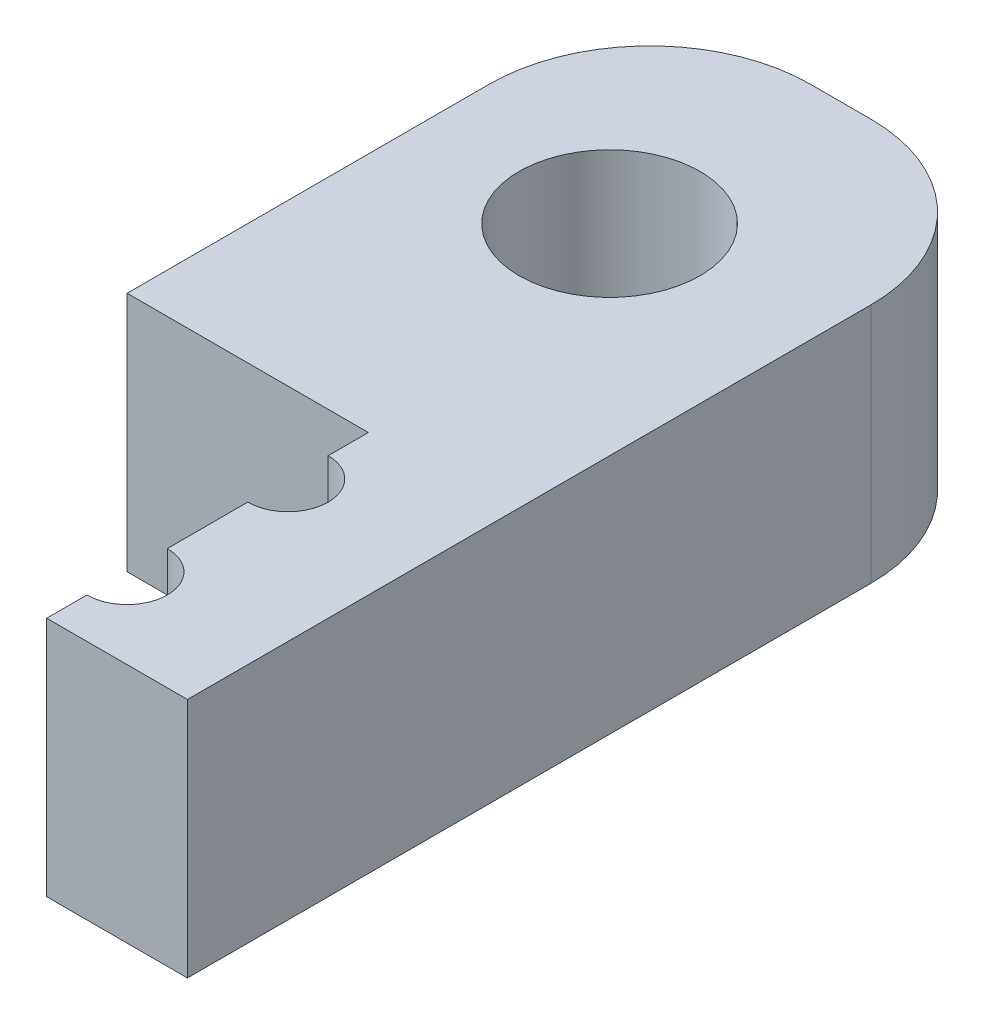
ISO-10303-21;
HEADER;
FILE_DESCRIPTION(('STEP AP214'),'2;1');
FILE_NAME('part.step','',(''),(''),'','','');
FILE_SCHEMA(('AUTOMOTIVE_DESIGN { 1 0 10303 214 1 1 1 1 }'));
ENDSEC;
DATA;
#1=APPLICATION_CONTEXT('core data for automotive mechanical design processes');
#2=APPLICATION_PROTOCOL_DEFINITION('international standard','automotive_design',2000,#1);
#3=PRODUCT_CONTEXT('',#1,'mechanical');
#4=PRODUCT('Part','Part','',(#3));
#5=PRODUCT_RELATED_PRODUCT_CATEGORY('part','',(#4));
#6=PRODUCT_DEFINITION_FORMATION('','',#4);
#7=PRODUCT_DEFINITION_CONTEXT('part definition',#1,'design');
#8=PRODUCT_DEFINITION('design','',#6,#7);
#9=PRODUCT_DEFINITION_SHAPE('','',#8);
#10=(LENGTH_UNIT() NAMED_UNIT(*) SI_UNIT(.MILLI.,.METRE.));
#11=(NAMED_UNIT(*) PLANE_ANGLE_UNIT() SI_UNIT($,.RADIAN.));
#12=(NAMED_UNIT(*) SI_UNIT($,.STERADIAN.) SOLID_ANGLE_UNIT());
#13=UNCERTAINTY_MEASURE_WITH_UNIT(LENGTH_MEASURE(1.E-05),#10,'distance_accuracy_value','');
#14=(GEOMETRIC_REPRESENTATION_CONTEXT(3) GLOBAL_UNCERTAINTY_ASSIGNED_CONTEXT((#13)) GLOBAL_UNIT_ASSIGNED_CONTEXT((#10,
#11,#12)) REPRESENTATION_CONTEXT('',''));
#15=CARTESIAN_POINT('',(0.,0.,0.));
#16=DIRECTION('',(0.,0.,1.));
#17=DIRECTION('',(1.,0.,0.));
#18=AXIS2_PLACEMENT_3D('',#15,#16,#17);
#19=CARTESIAN_POINT('',(6.,6.,0.));
#20=DIRECTION('',(1.,0.,0.));
#21=DIRECTION('',(0.,0.,-1.));
#22=AXIS2_PLACEMENT_3D('',#19,#20,#21);
#23=PLANE('',#22);
#24=DIRECTION('',(0.,0.,1.));
#25=VECTOR('',#24,1.);
#26=CARTESIAN_POINT('',(6.,0.,0.));
#27=LINE('',#26,#25);
#28=CARTESIAN_POINT('',(6.,0.,3.));
#29=VERTEX_POINT('',#28);
#30=CARTESIAN_POINT('',(6.,0.,5.));
#31=VERTEX_POINT('',#30);
#32=EDGE_CURVE('E151',#29,#31,#27,.T.);
#33=ORIENTED_EDGE('',*,*,#32,.T.);
#34=DIRECTION('',(0.,1.,0.));
#35=VECTOR('',#34,1.);
#36=CARTESIAN_POINT('',(6.,0.,5.));
#37=LINE('',#36,#35);
#38=CARTESIAN_POINT('',(6.,6.,5.));
#39=VERTEX_POINT('',#38);
#40=EDGE_CURVE('E131',#31,#39,#37,.T.);
#41=ORIENTED_EDGE('',*,*,#40,.T.);
#42=DIRECTION('',(0.,0.,1.));
#43=VECTOR('',#42,1.);
#44=CARTESIAN_POINT('',(6.,6.,0.));
#45=LINE('',#44,#43);
#46=CARTESIAN_POINT('',(6.,6.,3.));
#47=VERTEX_POINT('',#46);
#48=EDGE_CURVE('E221',#47,#39,#45,.T.);
#49=ORIENTED_EDGE('',*,*,#48,.F.);
#50=DIRECTION('',(0.,1.,0.));
#51=VECTOR('',#50,1.);
#52=CARTESIAN_POINT('',(6.,0.,3.));
#53=LINE('',#52,#51);
#54=EDGE_CURVE('E225',#47,#29,#53,.F.);
#55=ORIENTED_EDGE('',*,*,#54,.T.);
#56=EDGE_LOOP('',(#33,#41,#49,#55));
#57=FACE_BOUND('',#56,.T.);
#58=ADVANCED_FACE('F35',(#57),#23,.F.);
#59=CARTESIAN_POINT('',(6.,0.,0.));
#60=VERTEX_POINT('',#59);
#61=CARTESIAN_POINT('',(6.,0.,1.));
#62=VERTEX_POINT('',#61);
#63=EDGE_CURVE('E154',#60,#62,#27,.T.);
#64=ORIENTED_EDGE('',*,*,#63,.T.);
#65=DIRECTION('',(0.,1.,0.));
#66=VECTOR('',#65,1.);
#67=CARTESIAN_POINT('',(6.,0.,1.));
#68=LINE('',#67,#66);
#69=CARTESIAN_POINT('',(6.,6.,1.));
#70=VERTEX_POINT('',#69);
#71=EDGE_CURVE('E214',#62,#70,#68,.T.);
#72=ORIENTED_EDGE('',*,*,#71,.T.);
#73=CARTESIAN_POINT('',(6.,6.,0.));
#74=VERTEX_POINT('',#73);
#75=EDGE_CURVE('E218',#74,#70,#45,.T.);
#76=ORIENTED_EDGE('',*,*,#75,.F.);
#77=DIRECTION('',(0.,-1.,0.));
#78=VECTOR('',#77,1.);
#79=CARTESIAN_POINT('',(6.,6.,0.));
#80=LINE('',#79,#78);
#81=EDGE_CURVE('E175',#74,#60,#80,.T.);
#82=ORIENTED_EDGE('',*,*,#81,.T.);
#83=EDGE_LOOP('',(#64,#72,#76,#82));
#84=FACE_BOUND('',#83,.T.);
#85=ADVANCED_FACE('F261',(#84),#23,.F.);
#86=CARTESIAN_POINT('',(9.5,6.,8.));
#87=DIRECTION('',(-1.,0.,0.));
#88=DIRECTION('',(0.,0.,1.));
#89=AXIS2_PLACEMENT_3D('',#86,#87,#88);
#90=PLANE('',#89);
#91=DIRECTION('',(0.,0.,-1.));
#92=VECTOR('',#91,1.);
#93=CARTESIAN_POINT('',(9.5,0.,8.));
#94=LINE('',#93,#92);
#95=CARTESIAN_POINT('',(9.5,0.,8.));
#96=VERTEX_POINT('',#95);
#97=CARTESIAN_POINT('',(9.5,0.,-9.));
#98=VERTEX_POINT('',#97);
#99=EDGE_CURVE('E211',#96,#98,#94,.T.);
#100=ORIENTED_EDGE('',*,*,#99,.T.);
#101=DIRECTION('',(0.,-1.,0.));
#102=VECTOR('',#101,1.);
#103=CARTESIAN_POINT('',(9.5,6.,-9.));
#104=LINE('',#103,#102);
#105=CARTESIAN_POINT('',(9.5,6.,-9.));
#106=VERTEX_POINT('',#105);
#107=EDGE_CURVE('E11',#98,#106,#104,.F.);
#108=ORIENTED_EDGE('',*,*,#107,.T.);
#109=DIRECTION('',(0.,0.,-1.));
#110=VECTOR('',#109,1.);
#111=CARTESIAN_POINT('',(9.5,6.,8.));
#112=LINE('',#111,#110);
#113=CARTESIAN_POINT('',(9.5,6.,8.));
#114=VERTEX_POINT('',#113);
#115=EDGE_CURVE('E163',#114,#106,#112,.T.);
#116=ORIENTED_EDGE('',*,*,#115,.F.);
#117=DIRECTION('',(0.,-1.,0.));
#118=VECTOR('',#117,1.);
#119=CARTESIAN_POINT('',(9.5,6.,8.));
#120=LINE('',#119,#118);
#121=EDGE_CURVE('E170',#114,#96,#120,.T.);
#122=ORIENTED_EDGE('',*,*,#121,.T.);
#123=EDGE_LOOP('',(#100,#108,#116,#122));
#124=FACE_BOUND('',#123,.T.);
#125=ADVANCED_FACE('F267',(#124),#90,.F.);
#126=CARTESIAN_POINT('',(0.,6.,-13.));
#127=DIRECTION('',(0.,0.,1.));
#128=DIRECTION('',(1.,0.,0.));
#129=AXIS2_PLACEMENT_3D('',#126,#127,#128);
#130=PLANE('',#129);
#131=DIRECTION('',(-1.,0.,0.));
#132=VECTOR('',#131,1.);
#133=CARTESIAN_POINT('',(0.,0.,-13.));
#134=LINE('',#133,#132);
#135=CARTESIAN_POINT('',(5.5,0.,-13.));
#136=VERTEX_POINT('',#135);
#137=CARTESIAN_POINT('',(4.,0.,-13.));
#138=VERTEX_POINT('',#137);
#139=EDGE_CURVE('E207',#136,#138,#134,.T.);
#140=ORIENTED_EDGE('',*,*,#139,.T.);
#141=DIRECTION('',(0.,-1.,0.));
#142=VECTOR('',#141,1.);
#143=CARTESIAN_POINT('',(4.,6.,-13.));
#144=LINE('',#143,#142);
#145=CARTESIAN_POINT('',(4.,6.,-13.));
#146=VERTEX_POINT('',#145);
#147=EDGE_CURVE('E56',#138,#146,#144,.F.);
#148=ORIENTED_EDGE('',*,*,#147,.T.);
#149=DIRECTION('',(-1.,0.,0.));
#150=VECTOR('',#149,1.);
#151=CARTESIAN_POINT('',(0.,6.,-13.));
#152=LINE('',#151,#150);
#153=CARTESIAN_POINT('',(5.5,6.,-13.));
#154=VERTEX_POINT('',#153);
#155=EDGE_CURVE('E167',#154,#146,#152,.T.);
#156=ORIENTED_EDGE('',*,*,#155,.F.);
#157=DIRECTION('',(0.,-1.,0.));
#158=VECTOR('',#157,1.);
#159=CARTESIAN_POINT('',(5.5,6.,-13.));
#160=LINE('',#159,#158);
#161=EDGE_CURVE('E187',#154,#136,#160,.T.);
#162=ORIENTED_EDGE('',*,*,#161,.T.);
#163=EDGE_LOOP('',(#140,#148,#156,#162));
#164=FACE_BOUND('',#163,.T.);
#165=ADVANCED_FACE('F209',(#164),#130,.F.);
#166=CARTESIAN_POINT('',(0.,6.,0.));
#167=DIRECTION('',(1.,0.,0.));
#168=DIRECTION('',(0.,0.,-1.));
#169=AXIS2_PLACEMENT_3D('',#166,#167,#168);
#170=PLANE('',#169);
#171=DIRECTION('',(0.,0.,1.));
#172=VECTOR('',#171,1.);
#173=CARTESIAN_POINT('',(0.,6.,0.));
#174=LINE('',#173,#172);
#175=CARTESIAN_POINT('',(0.,6.,-9.));
#176=VERTEX_POINT('',#175);
#177=CARTESIAN_POINT('',(0.,6.,0.));
#178=VERTEX_POINT('',#177);
#179=EDGE_CURVE('E196',#176,#178,#174,.T.);
#180=ORIENTED_EDGE('',*,*,#179,.F.);
#181=DIRECTION('',(0.,-1.,0.));
#182=VECTOR('',#181,1.);
#183=CARTESIAN_POINT('',(0.,6.,-9.));
#184=LINE('',#183,#182);
#185=CARTESIAN_POINT('',(0.,0.,-9.));
#186=VERTEX_POINT('',#185);
#187=EDGE_CURVE('E180',#176,#186,#184,.T.);
#188=ORIENTED_EDGE('',*,*,#187,.T.);
#189=DIRECTION('',(0.,0.,1.));
#190=VECTOR('',#189,1.);
#191=CARTESIAN_POINT('',(0.,0.,0.));
#192=LINE('',#191,#190);
#193=CARTESIAN_POINT('',(0.,0.,0.));
#194=VERTEX_POINT('',#193);
#195=EDGE_CURVE('E155',#186,#194,#192,.T.);
#196=ORIENTED_EDGE('',*,*,#195,.T.);
#197=DIRECTION('',(0.,-1.,0.));
#198=VECTOR('',#197,1.);
#199=CARTESIAN_POINT('',(0.,6.,0.));
#200=LINE('',#199,#198);
#201=EDGE_CURVE('E177',#178,#194,#200,.T.);
#202=ORIENTED_EDGE('',*,*,#201,.F.);
#203=EDGE_LOOP('',(#180,#188,#196,#202));
#204=FACE_BOUND('',#203,.T.);
#205=ADVANCED_FACE('F201',(#204),#170,.F.);
#206=CARTESIAN_POINT('',(0.,6.,0.));
#207=DIRECTION('',(0.,0.,-1.));
#208=DIRECTION('',(-1.,0.,0.));
#209=AXIS2_PLACEMENT_3D('',#206,#207,#208);
#210=PLANE('',#209);
#211=DIRECTION('',(1.,0.,0.));
#212=VECTOR('',#211,1.);
#213=CARTESIAN_POINT('',(0.,0.,0.));
#214=LINE('',#213,#212);
#215=EDGE_CURVE('E152',#194,#60,#214,.T.);
#216=ORIENTED_EDGE('',*,*,#215,.T.);
#217=ORIENTED_EDGE('',*,*,#81,.F.);
#218=DIRECTION('',(1.,0.,0.));
#219=VECTOR('',#218,1.);
#220=CARTESIAN_POINT('',(0.,6.,0.));
#221=LINE('',#220,#219);
#222=EDGE_CURVE('E203',#178,#74,#221,.T.);
#223=ORIENTED_EDGE('',*,*,#222,.F.);
#224=ORIENTED_EDGE('',*,*,#201,.T.);
#225=EDGE_LOOP('',(#216,#217,#223,#224));
#226=FACE_BOUND('',#225,.T.);
#227=ADVANCED_FACE('F270',(#226),#210,.F.);
#228=CARTESIAN_POINT('',(6.,6.,7.));
#229=VERTEX_POINT('',#228);
#230=CARTESIAN_POINT('',(6.,6.,8.));
#231=VERTEX_POINT('',#230);
#232=EDGE_CURVE('E144',#229,#231,#45,.T.);
#233=ORIENTED_EDGE('',*,*,#232,.F.);
#234=DIRECTION('',(0.,1.,0.));
#235=VECTOR('',#234,1.);
#236=CARTESIAN_POINT('',(6.,0.,7.));
#237=LINE('',#236,#235);
#238=CARTESIAN_POINT('',(6.,0.,7.));
#239=VERTEX_POINT('',#238);
#240=EDGE_CURVE('E128',#229,#239,#237,.F.);
#241=ORIENTED_EDGE('',*,*,#240,.T.);
#242=CARTESIAN_POINT('',(6.,0.,8.));
#243=VERTEX_POINT('',#242);
#244=EDGE_CURVE('E142',#239,#243,#27,.T.);
#245=ORIENTED_EDGE('',*,*,#244,.T.);
#246=DIRECTION('',(0.,-1.,0.));
#247=VECTOR('',#246,1.);
#248=CARTESIAN_POINT('',(6.,6.,8.));
#249=LINE('',#248,#247);
#250=EDGE_CURVE('E172',#231,#243,#249,.T.);
#251=ORIENTED_EDGE('',*,*,#250,.F.);
#252=EDGE_LOOP('',(#233,#241,#245,#251));
#253=FACE_BOUND('',#252,.T.);
#254=ADVANCED_FACE('F140',(#253),#23,.F.);
#255=CARTESIAN_POINT('',(6.,6.,8.));
#256=DIRECTION('',(0.,0.,-1.));
#257=DIRECTION('',(-1.,0.,0.));
#258=AXIS2_PLACEMENT_3D('',#255,#256,#257);
#259=PLANE('',#258);
#260=DIRECTION('',(1.,0.,0.));
#261=VECTOR('',#260,1.);
#262=CARTESIAN_POINT('',(6.,0.,8.));
#263=LINE('',#262,#261);
#264=EDGE_CURVE('E150',#243,#96,#263,.T.);
#265=ORIENTED_EDGE('',*,*,#264,.T.);
#266=ORIENTED_EDGE('',*,*,#121,.F.);
#267=DIRECTION('',(1.,0.,0.));
#268=VECTOR('',#267,1.);
#269=CARTESIAN_POINT('',(6.,6.,8.));
#270=LINE('',#269,#268);
#271=EDGE_CURVE('E173',#231,#114,#270,.T.);
#272=ORIENTED_EDGE('',*,*,#271,.F.);
#273=ORIENTED_EDGE('',*,*,#250,.T.);
#274=EDGE_LOOP('',(#265,#266,#272,#273));
#275=FACE_BOUND('',#274,.T.);
#276=ADVANCED_FACE('F250',(#275),#259,.F.);
#277=CARTESIAN_POINT('',(0.,6.,0.));
#278=DIRECTION('',(0.,-1.,0.));
#279=DIRECTION('',(0.,0.,-1.));
#280=AXIS2_PLACEMENT_3D('',#277,#278,#279);
#281=PLANE('',#280);
#282=CARTESIAN_POINT('',(4.5,6.,-7.5));
#283=DIRECTION('',(0.,1.,0.));
#284=DIRECTION('',(0.,0.,1.));
#285=AXIS2_PLACEMENT_3D('',#282,#283,#284);
#286=CIRCLE('',#285,2.25);
#287=CARTESIAN_POINT('',(4.5,6.,-5.25));
#288=VERTEX_POINT('',#287);
#289=EDGE_CURVE('E236',#288,#288,#286,.T.);
#290=ORIENTED_EDGE('',*,*,#289,.F.);
#291=EDGE_LOOP('',(#290));
#292=FACE_BOUND('',#291,.T.);
#293=ORIENTED_EDGE('',*,*,#155,.T.);
#294=CARTESIAN_POINT('',(4.,6.,-9.));
#295=DIRECTION('',(0.,-1.,0.));
#296=DIRECTION('',(0.,0.,-1.));
#297=AXIS2_PLACEMENT_3D('',#294,#295,#296);
#298=CIRCLE('',#297,4.);
#299=EDGE_CURVE('E43',#146,#176,#298,.F.);
#300=ORIENTED_EDGE('',*,*,#299,.T.);
#301=ORIENTED_EDGE('',*,*,#179,.T.);
#302=ORIENTED_EDGE('',*,*,#222,.T.);
#303=ORIENTED_EDGE('',*,*,#75,.T.);
#304=CARTESIAN_POINT('',(6.,6.,2.));
#305=DIRECTION('',(0.,1.,0.));
#306=DIRECTION('',(0.,0.,1.));
#307=AXIS2_PLACEMENT_3D('',#304,#305,#306);
#308=CIRCLE('',#307,1.);
#309=EDGE_CURVE('E229',#47,#70,#308,.T.);
#310=ORIENTED_EDGE('',*,*,#309,.F.);
#311=ORIENTED_EDGE('',*,*,#48,.T.);
#312=CARTESIAN_POINT('',(6.,6.,6.));
#313=DIRECTION('',(0.,1.,0.));
#314=DIRECTION('',(0.,0.,1.));
#315=AXIS2_PLACEMENT_3D('',#312,#313,#314);
#316=CIRCLE('',#315,1.);
#317=EDGE_CURVE('E136',#229,#39,#316,.T.);
#318=ORIENTED_EDGE('',*,*,#317,.F.);
#319=ORIENTED_EDGE('',*,*,#232,.T.);
#320=ORIENTED_EDGE('',*,*,#271,.T.);
#321=ORIENTED_EDGE('',*,*,#115,.T.);
#322=CARTESIAN_POINT('',(5.5,6.,-9.));
#323=DIRECTION('',(0.,-1.,0.));
#324=DIRECTION('',(0.,0.,-1.));
#325=AXIS2_PLACEMENT_3D('',#322,#323,#324);
#326=CIRCLE('',#325,4.);
#327=EDGE_CURVE('E191',#106,#154,#326,.F.);
#328=ORIENTED_EDGE('',*,*,#327,.T.);
#329=EDGE_LOOP('',(#293,#300,#301,#302,#303,#310,#311,#318,#319,#320,#321,#328));
#330=FACE_BOUND('',#329,.T.);
#331=ADVANCED_FACE('F195',(#292,#330),#281,.F.);
#332=CARTESIAN_POINT('',(0.,0.,0.));
#333=DIRECTION('',(0.,-1.,0.));
#334=DIRECTION('',(0.,0.,-1.));
#335=AXIS2_PLACEMENT_3D('',#332,#333,#334);
#336=PLANE('',#335);
#337=CARTESIAN_POINT('',(4.5,0.,-7.5));
#338=DIRECTION('',(0.,1.,0.));
#339=DIRECTION('',(0.,0.,1.));
#340=AXIS2_PLACEMENT_3D('',#337,#338,#339);
#341=CIRCLE('',#340,2.25);
#342=CARTESIAN_POINT('',(4.5,0.,-5.25));
#343=VERTEX_POINT('',#342);
#344=EDGE_CURVE('E234',#343,#343,#341,.T.);
#345=ORIENTED_EDGE('',*,*,#344,.T.);
#346=EDGE_LOOP('',(#345));
#347=FACE_BOUND('',#346,.T.);
#348=ORIENTED_EDGE('',*,*,#195,.F.);
#349=CARTESIAN_POINT('',(4.,0.,-9.));
#350=DIRECTION('',(0.,-1.,0.));
#351=DIRECTION('',(0.,0.,-1.));
#352=AXIS2_PLACEMENT_3D('',#349,#350,#351);
#353=CIRCLE('',#352,4.);
#354=EDGE_CURVE('E185',#186,#138,#353,.T.);
#355=ORIENTED_EDGE('',*,*,#354,.T.);
#356=ORIENTED_EDGE('',*,*,#139,.F.);
#357=CARTESIAN_POINT('',(5.5,0.,-9.));
#358=DIRECTION('',(0.,-1.,0.));
#359=DIRECTION('',(0.,0.,-1.));
#360=AXIS2_PLACEMENT_3D('',#357,#358,#359);
#361=CIRCLE('',#360,4.);
#362=EDGE_CURVE('E183',#136,#98,#361,.T.);
#363=ORIENTED_EDGE('',*,*,#362,.T.);
#364=ORIENTED_EDGE('',*,*,#99,.F.);
#365=ORIENTED_EDGE('',*,*,#264,.F.);
#366=ORIENTED_EDGE('',*,*,#244,.F.);
#367=CARTESIAN_POINT('',(6.,0.,6.));
#368=DIRECTION('',(0.,1.,0.));
#369=DIRECTION('',(0.,0.,1.));
#370=AXIS2_PLACEMENT_3D('',#367,#368,#369);
#371=CIRCLE('',#370,1.);
#372=EDGE_CURVE('E125',#239,#31,#371,.T.);
#373=ORIENTED_EDGE('',*,*,#372,.T.);
#374=ORIENTED_EDGE('',*,*,#32,.F.);
#375=CARTESIAN_POINT('',(6.,0.,2.));
#376=DIRECTION('',(0.,1.,0.));
#377=DIRECTION('',(0.,0.,1.));
#378=AXIS2_PLACEMENT_3D('',#375,#376,#377);
#379=CIRCLE('',#378,1.);
#380=EDGE_CURVE('E228',#29,#62,#379,.T.);
#381=ORIENTED_EDGE('',*,*,#380,.T.);
#382=ORIENTED_EDGE('',*,*,#63,.F.);
#383=ORIENTED_EDGE('',*,*,#215,.F.);
#384=EDGE_LOOP('',(#348,#355,#356,#363,#364,#365,#366,#373,#374,#381,#382,#383));
#385=FACE_BOUND('',#384,.T.);
#386=ADVANCED_FACE('F148',(#347,#385),#336,.T.);
#387=CARTESIAN_POINT('',(6.,0.,2.));
#388=DIRECTION('',(0.,1.,0.));
#389=DIRECTION('',(0.,0.,1.));
#390=AXIS2_PLACEMENT_3D('',#387,#388,#389);
#391=CYLINDRICAL_SURFACE('',#390,1.);
#392=ORIENTED_EDGE('',*,*,#380,.F.);
#393=ORIENTED_EDGE('',*,*,#54,.F.);
#394=ORIENTED_EDGE('',*,*,#309,.T.);
#395=ORIENTED_EDGE('',*,*,#71,.F.);
#396=EDGE_LOOP('',(#392,#393,#394,#395));
#397=FACE_BOUND('',#396,.T.);
#398=ADVANCED_FACE('F256',(#397),#391,.F.);
#399=CARTESIAN_POINT('',(6.,0.,6.));
#400=DIRECTION('',(0.,1.,0.));
#401=DIRECTION('',(0.,0.,1.));
#402=AXIS2_PLACEMENT_3D('',#399,#400,#401);
#403=CYLINDRICAL_SURFACE('',#402,1.);
#404=ORIENTED_EDGE('',*,*,#372,.F.);
#405=ORIENTED_EDGE('',*,*,#240,.F.);
#406=ORIENTED_EDGE('',*,*,#317,.T.);
#407=ORIENTED_EDGE('',*,*,#40,.F.);
#408=EDGE_LOOP('',(#404,#405,#406,#407));
#409=FACE_BOUND('',#408,.T.);
#410=ADVANCED_FACE('F127',(#409),#403,.F.);
#411=CARTESIAN_POINT('',(4.5,0.,-7.5));
#412=DIRECTION('',(0.,1.,0.));
#413=DIRECTION('',(0.,0.,1.));
#414=AXIS2_PLACEMENT_3D('',#411,#412,#413);
#415=CYLINDRICAL_SURFACE('',#414,2.25);
#416=ORIENTED_EDGE('',*,*,#344,.F.);
#417=EDGE_LOOP('',(#416));
#418=FACE_BOUND('',#417,.T.);
#419=ORIENTED_EDGE('',*,*,#289,.T.);
#420=EDGE_LOOP('',(#419));
#421=FACE_BOUND('',#420,.T.);
#422=ADVANCED_FACE('F243',(#418,#421),#415,.F.);
#423=CARTESIAN_POINT('',(4.,6.,-9.));
#424=DIRECTION('',(0.,-1.,0.));
#425=DIRECTION('',(0.,0.,-1.));
#426=AXIS2_PLACEMENT_3D('',#423,#424,#425);
#427=CYLINDRICAL_SURFACE('',#426,4.);
#428=ORIENTED_EDGE('',*,*,#299,.F.);
#429=ORIENTED_EDGE('',*,*,#147,.F.);
#430=ORIENTED_EDGE('',*,*,#354,.F.);
#431=ORIENTED_EDGE('',*,*,#187,.F.);
#432=EDGE_LOOP('',(#428,#429,#430,#431));
#433=FACE_BOUND('',#432,.T.);
#434=ADVANCED_FACE('F205',(#433),#427,.T.);
#435=CARTESIAN_POINT('',(5.5,6.,-9.));
#436=DIRECTION('',(0.,-1.,0.));
#437=DIRECTION('',(0.,0.,-1.));
#438=AXIS2_PLACEMENT_3D('',#435,#436,#437);
#439=CYLINDRICAL_SURFACE('',#438,4.);
#440=ORIENTED_EDGE('',*,*,#327,.F.);
#441=ORIENTED_EDGE('',*,*,#107,.F.);
#442=ORIENTED_EDGE('',*,*,#362,.F.);
#443=ORIENTED_EDGE('',*,*,#161,.F.);
#444=EDGE_LOOP('',(#440,#441,#442,#443));
#445=FACE_BOUND('',#444,.T.);
#446=ADVANCED_FACE('F37',(#445),#439,.T.);
#447=CLOSED_SHELL('',(#58,#85,#125,#165,#205,#227,#254,#276,#331,#386,#398,#410,#422,#434,#446));
#448=MANIFOLD_SOLID_BREP('B2',#447);
#449=ADVANCED_BREP_SHAPE_REPRESENTATION('',(#18,#448),#14);
#450=SHAPE_DEFINITION_REPRESENTATION(#9,#449);
ENDSEC;
END-ISO-10303-21;
